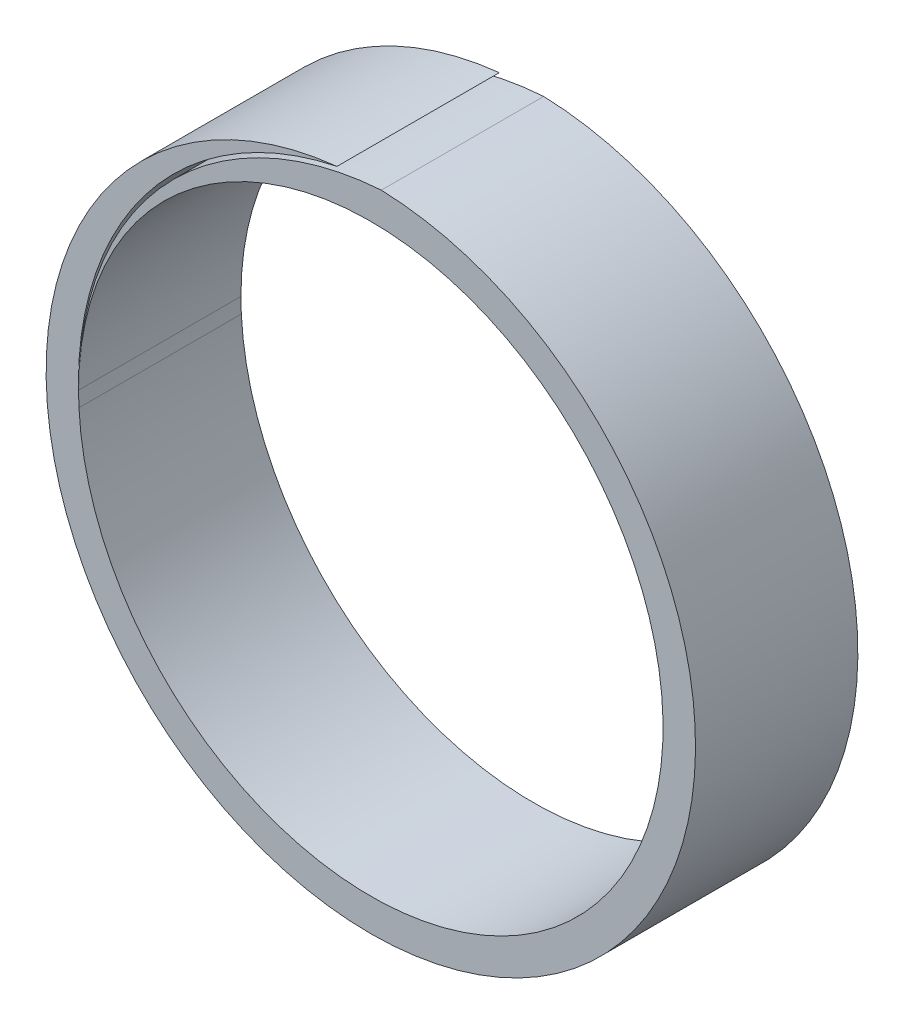
ISO-10303-21;
HEADER;
FILE_DESCRIPTION(('STEP AP214'),'2;1');
FILE_NAME('part.step','',(''),(''),'','','');
FILE_SCHEMA(('AUTOMOTIVE_DESIGN { 1 0 10303 214 1 1 1 1 }'));
ENDSEC;
DATA;
#1=APPLICATION_CONTEXT('core data for automotive mechanical design processes');
#2=APPLICATION_PROTOCOL_DEFINITION('international standard','automotive_design',2000,#1);
#3=PRODUCT_CONTEXT('',#1,'mechanical');
#4=PRODUCT('Part','Part','',(#3));
#5=PRODUCT_RELATED_PRODUCT_CATEGORY('part','',(#4));
#6=PRODUCT_DEFINITION_FORMATION('','',#4);
#7=PRODUCT_DEFINITION_CONTEXT('part definition',#1,'design');
#8=PRODUCT_DEFINITION('design','',#6,#7);
#9=PRODUCT_DEFINITION_SHAPE('','',#8);
#10=(LENGTH_UNIT() NAMED_UNIT(*) SI_UNIT(.MILLI.,.METRE.));
#11=(NAMED_UNIT(*) PLANE_ANGLE_UNIT() SI_UNIT($,.RADIAN.));
#12=(NAMED_UNIT(*) SI_UNIT($,.STERADIAN.) SOLID_ANGLE_UNIT());
#13=UNCERTAINTY_MEASURE_WITH_UNIT(LENGTH_MEASURE(1.E-05),#10,'distance_accuracy_value','');
#14=(GEOMETRIC_REPRESENTATION_CONTEXT(3) GLOBAL_UNCERTAINTY_ASSIGNED_CONTEXT((#13)) GLOBAL_UNIT_ASSIGNED_CONTEXT((#10,
#11,#12)) REPRESENTATION_CONTEXT('',''));
#15=CARTESIAN_POINT('',(0.,0.,0.));
#16=DIRECTION('',(0.,0.,1.));
#17=DIRECTION('',(1.,0.,0.));
#18=AXIS2_PLACEMENT_3D('',#15,#16,#17);
#19=CARTESIAN_POINT('',(0.,0.,10.));
#20=DIRECTION('',(0.,0.,-1.));
#21=DIRECTION('',(-1.,0.,0.));
#22=AXIS2_PLACEMENT_3D('',#19,#20,#21);
#23=CYLINDRICAL_SURFACE('',#22,18.);
#24=CARTESIAN_POINT('',(0.,0.,0.));
#25=DIRECTION('',(0.,0.,1.));
#26=DIRECTION('',(1.,0.,0.));
#27=AXIS2_PLACEMENT_3D('',#24,#25,#26);
#28=CIRCLE('',#27,18.);
#29=CARTESIAN_POINT('',(-17.9759885798296,-0.929427015873467,0.));
#30=VERTEX_POINT('',#29);
#31=CARTESIAN_POINT('',(-18.,0.,0.));
#32=VERTEX_POINT('',#31);
#33=EDGE_CURVE('E98',#30,#32,#28,.T.);
#34=ORIENTED_EDGE('',*,*,#33,.F.);
#35=DIRECTION('',(0.,0.,-1.));
#36=VECTOR('',#35,1.);
#37=CARTESIAN_POINT('',(-17.9759885798296,-0.929427015873467,10.));
#38=LINE('',#37,#36);
#39=CARTESIAN_POINT('',(-17.9759885798296,-0.929427015873467,10.));
#40=VERTEX_POINT('',#39);
#41=EDGE_CURVE('E11',#40,#30,#38,.T.);
#42=ORIENTED_EDGE('',*,*,#41,.F.);
#43=CARTESIAN_POINT('',(0.,0.,10.));
#44=DIRECTION('',(0.,0.,1.));
#45=DIRECTION('',(1.,0.,0.));
#46=AXIS2_PLACEMENT_3D('',#43,#44,#45);
#47=CIRCLE('',#46,18.);
#48=CARTESIAN_POINT('',(-18.,0.,10.));
#49=VERTEX_POINT('',#48);
#50=EDGE_CURVE('E83',#40,#49,#47,.T.);
#51=ORIENTED_EDGE('',*,*,#50,.T.);
#52=DIRECTION('',(0.,0.,-1.));
#53=VECTOR('',#52,1.);
#54=CARTESIAN_POINT('',(-18.,0.,10.));
#55=LINE('',#54,#53);
#56=EDGE_CURVE('E51',#49,#32,#55,.T.);
#57=ORIENTED_EDGE('',*,*,#56,.T.);
#58=EDGE_LOOP('',(#34,#42,#51,#57));
#59=FACE_BOUND('',#58,.T.);
#60=ADVANCED_FACE('F35',(#59),#23,.F.);
#61=CARTESIAN_POINT('',(1.98558774993486,0.309713989414834,10.));
#62=DIRECTION('',(0.,0.,-1.));
#63=DIRECTION('',(-1.,0.,0.));
#64=AXIS2_PLACEMENT_3D('',#61,#62,#63);
#65=CYLINDRICAL_SURFACE('',#64,20.);
#66=CARTESIAN_POINT('',(1.98558774993486,0.309713989414834,0.));
#67=DIRECTION('',(0.,0.,1.));
#68=DIRECTION('',(1.,0.,0.));
#69=AXIS2_PLACEMENT_3D('',#66,#67,#68);
#70=CIRCLE('',#69,20.);
#71=CARTESIAN_POINT('',(-2.08566238493151,19.8909530293569,0.));
#72=VERTEX_POINT('',#71);
#73=EDGE_CURVE('E89',#30,#72,#70,.F.);
#74=ORIENTED_EDGE('',*,*,#73,.T.);
#75=DIRECTION('',(0.,0.,-1.));
#76=VECTOR('',#75,1.);
#77=CARTESIAN_POINT('',(-2.08566238493151,19.8909530293569,10.));
#78=LINE('',#77,#76);
#79=CARTESIAN_POINT('',(-2.08566238493151,19.8909530293569,10.));
#80=VERTEX_POINT('',#79);
#81=EDGE_CURVE('E43',#80,#72,#78,.T.);
#82=ORIENTED_EDGE('',*,*,#81,.F.);
#83=CARTESIAN_POINT('',(1.98558774993486,0.309713989414834,10.));
#84=DIRECTION('',(0.,0.,1.));
#85=DIRECTION('',(1.,0.,0.));
#86=AXIS2_PLACEMENT_3D('',#83,#84,#85);
#87=CIRCLE('',#86,20.);
#88=EDGE_CURVE('E77',#40,#80,#87,.F.);
#89=ORIENTED_EDGE('',*,*,#88,.F.);
#90=ORIENTED_EDGE('',*,*,#41,.T.);
#91=EDGE_LOOP('',(#74,#82,#89,#90));
#92=FACE_BOUND('',#91,.T.);
#93=ADVANCED_FACE('F87',(#92),#65,.F.);
#94=CARTESIAN_POINT('',(0.,0.,10.));
#95=DIRECTION('',(0.,0.,-1.));
#96=DIRECTION('',(-1.,0.,0.));
#97=AXIS2_PLACEMENT_3D('',#94,#95,#96);
#98=CYLINDRICAL_SURFACE('',#97,20.);
#99=CARTESIAN_POINT('',(0.,0.,0.));
#100=DIRECTION('',(0.,0.,1.));
#101=DIRECTION('',(1.,0.,0.));
#102=AXIS2_PLACEMENT_3D('',#99,#100,#101);
#103=CIRCLE('',#102,20.);
#104=CARTESIAN_POINT('',(0.647064181519006,19.9895299580804,0.));
#105=VERTEX_POINT('',#104);
#106=EDGE_CURVE('E101',#72,#105,#103,.T.);
#107=ORIENTED_EDGE('',*,*,#106,.T.);
#108=DIRECTION('',(0.,0.,-1.));
#109=VECTOR('',#108,1.);
#110=CARTESIAN_POINT('',(0.647064181519006,19.9895299580804,10.));
#111=LINE('',#110,#109);
#112=CARTESIAN_POINT('',(0.647064181519006,19.9895299580804,10.));
#113=VERTEX_POINT('',#112);
#114=EDGE_CURVE('E65',#113,#105,#111,.T.);
#115=ORIENTED_EDGE('',*,*,#114,.F.);
#116=CARTESIAN_POINT('',(0.,0.,10.));
#117=DIRECTION('',(0.,0.,1.));
#118=DIRECTION('',(1.,0.,0.));
#119=AXIS2_PLACEMENT_3D('',#116,#117,#118);
#120=CIRCLE('',#119,20.);
#121=EDGE_CURVE('E82',#80,#113,#120,.T.);
#122=ORIENTED_EDGE('',*,*,#121,.F.);
#123=ORIENTED_EDGE('',*,*,#81,.T.);
#124=EDGE_LOOP('',(#107,#115,#122,#123));
#125=FACE_BOUND('',#124,.T.);
#126=ADVANCED_FACE('F92',(#125),#98,.T.);
#127=CARTESIAN_POINT('',(1.99996877497263,0.035341195792649,10.));
#128=DIRECTION('',(0.,0.,-1.));
#129=DIRECTION('',(-1.,0.,0.));
#130=AXIS2_PLACEMENT_3D('',#127,#128,#129);
#131=CYLINDRICAL_SURFACE('',#130,20.);
#132=CARTESIAN_POINT('',(1.99996877497263,0.035341195792649,0.));
#133=DIRECTION('',(0.,0.,1.));
#134=DIRECTION('',(1.,0.,0.));
#135=AXIS2_PLACEMENT_3D('',#132,#133,#134);
#136=CIRCLE('',#135,20.);
#137=EDGE_CURVE('E103',#32,#105,#136,.F.);
#138=ORIENTED_EDGE('',*,*,#137,.F.);
#139=ORIENTED_EDGE('',*,*,#56,.F.);
#140=CARTESIAN_POINT('',(1.99996877497263,0.035341195792649,10.));
#141=DIRECTION('',(0.,0.,1.));
#142=DIRECTION('',(1.,0.,0.));
#143=AXIS2_PLACEMENT_3D('',#140,#141,#142);
#144=CIRCLE('',#143,20.);
#145=EDGE_CURVE('E93',#49,#113,#144,.F.);
#146=ORIENTED_EDGE('',*,*,#145,.T.);
#147=ORIENTED_EDGE('',*,*,#114,.T.);
#148=EDGE_LOOP('',(#138,#139,#146,#147));
#149=FACE_BOUND('',#148,.T.);
#150=ADVANCED_FACE('F108',(#149),#131,.T.);
#151=CARTESIAN_POINT('',(0.,0.,10.));
#152=DIRECTION('',(0.,0.,1.));
#153=DIRECTION('',(1.,0.,0.));
#154=AXIS2_PLACEMENT_3D('',#151,#152,#153);
#155=PLANE('',#154);
#156=ORIENTED_EDGE('',*,*,#50,.F.);
#157=ORIENTED_EDGE('',*,*,#88,.T.);
#158=ORIENTED_EDGE('',*,*,#121,.T.);
#159=ORIENTED_EDGE('',*,*,#145,.F.);
#160=EDGE_LOOP('',(#156,#157,#158,#159));
#161=FACE_BOUND('',#160,.T.);
#162=ADVANCED_FACE('F79',(#161),#155,.T.);
#163=CARTESIAN_POINT('',(0.,0.,0.));
#164=DIRECTION('',(0.,0.,1.));
#165=DIRECTION('',(1.,0.,0.));
#166=AXIS2_PLACEMENT_3D('',#163,#164,#165);
#167=PLANE('',#166);
#168=ORIENTED_EDGE('',*,*,#33,.T.);
#169=ORIENTED_EDGE('',*,*,#137,.T.);
#170=ORIENTED_EDGE('',*,*,#106,.F.);
#171=ORIENTED_EDGE('',*,*,#73,.F.);
#172=EDGE_LOOP('',(#168,#169,#170,#171));
#173=FACE_BOUND('',#172,.T.);
#174=ADVANCED_FACE('F115',(#173),#167,.F.);
#175=CLOSED_SHELL('',(#60,#93,#126,#150,#162,#174));
#176=MANIFOLD_SOLID_BREP('B2',#175);
#177=ADVANCED_BREP_SHAPE_REPRESENTATION('',(#18,#176),#14);
#178=SHAPE_DEFINITION_REPRESENTATION(#9,#177);
ENDSEC;
END-ISO-10303-21;
